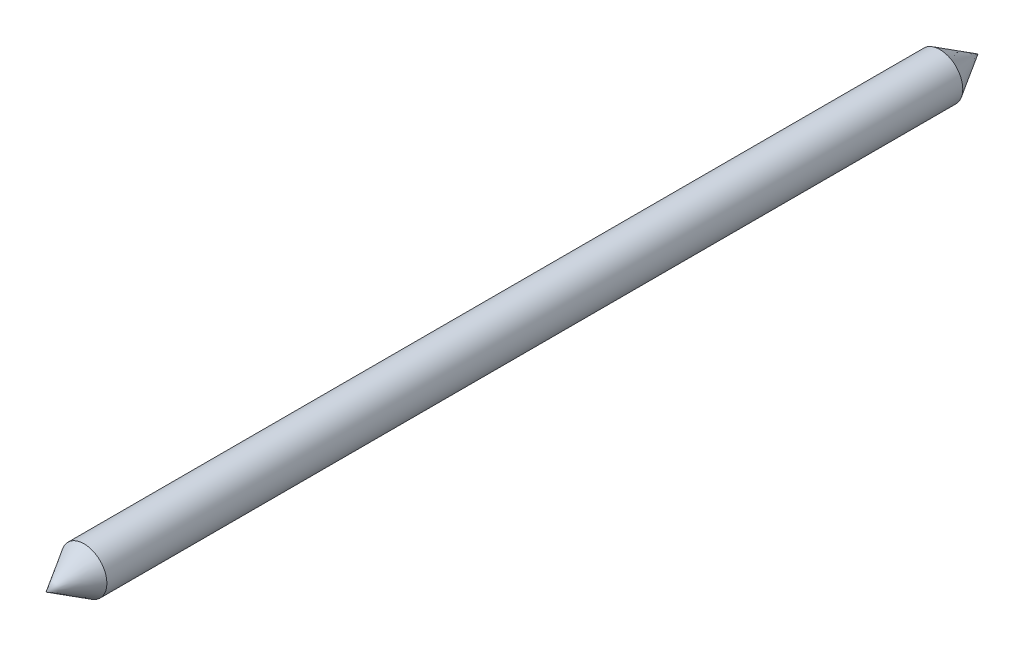
ISO-10303-21;
HEADER;
FILE_DESCRIPTION(('STEP AP214'),'2;1');
FILE_NAME('part.step','',(''),(''),'','','');
FILE_SCHEMA(('AUTOMOTIVE_DESIGN { 1 0 10303 214 1 1 1 1 }'));
ENDSEC;
DATA;
#1=APPLICATION_CONTEXT('core data for automotive mechanical design processes');
#2=APPLICATION_PROTOCOL_DEFINITION('international standard','automotive_design',2000,#1);
#3=PRODUCT_CONTEXT('',#1,'mechanical');
#4=PRODUCT('Part','Part','',(#3));
#5=PRODUCT_RELATED_PRODUCT_CATEGORY('part','',(#4));
#6=PRODUCT_DEFINITION_FORMATION('','',#4);
#7=PRODUCT_DEFINITION_CONTEXT('part definition',#1,'design');
#8=PRODUCT_DEFINITION('design','',#6,#7);
#9=PRODUCT_DEFINITION_SHAPE('','',#8);
#10=(LENGTH_UNIT() NAMED_UNIT(*) SI_UNIT(.MILLI.,.METRE.));
#11=(NAMED_UNIT(*) PLANE_ANGLE_UNIT() SI_UNIT($,.RADIAN.));
#12=(NAMED_UNIT(*) SI_UNIT($,.STERADIAN.) SOLID_ANGLE_UNIT());
#13=UNCERTAINTY_MEASURE_WITH_UNIT(LENGTH_MEASURE(1.E-05),#10,'distance_accuracy_value','');
#14=(GEOMETRIC_REPRESENTATION_CONTEXT(3) GLOBAL_UNCERTAINTY_ASSIGNED_CONTEXT((#13)) GLOBAL_UNIT_ASSIGNED_CONTEXT((#10,
#11,#12)) REPRESENTATION_CONTEXT('',''));
#15=CARTESIAN_POINT('',(0.,0.,0.));
#16=DIRECTION('',(0.,0.,1.));
#17=DIRECTION('',(1.,0.,0.));
#18=AXIS2_PLACEMENT_3D('',#15,#16,#17);
#19=CARTESIAN_POINT('',(0.,0.,-142.875));
#20=DIRECTION('',(0.,0.,1.));
#21=DIRECTION('',(1.,0.,0.));
#22=AXIS2_PLACEMENT_3D('',#19,#20,#21);
#23=CONICAL_SURFACE('',#22,7.62000000000001,0.540419500270585);
#24=CARTESIAN_POINT('',(0.,0.,-155.575));
#25=VERTEX_POINT('',#24);
#26=VERTEX_LOOP('',#25);
#27=FACE_BOUND('',#26,.T.);
#28=CARTESIAN_POINT('',(0.,0.,-142.875));
#29=DIRECTION('',(0.,0.,-1.));
#30=DIRECTION('',(-1.,0.,0.));
#31=AXIS2_PLACEMENT_3D('',#28,#29,#30);
#32=CIRCLE('',#31,7.62000000000001);
#33=CARTESIAN_POINT('',(-7.62,0.,-142.875));
#34=VERTEX_POINT('',#33);
#35=EDGE_CURVE('E11',#34,#34,#32,.T.);
#36=ORIENTED_EDGE('',*,*,#35,.T.);
#37=EDGE_LOOP('',(#36));
#38=FACE_BOUND('',#37,.T.);
#39=ADVANCED_FACE('F45',(#27,#38),#23,.T.);
#40=CARTESIAN_POINT('',(0.,0.,-155.575));
#41=DIRECTION('',(0.,0.,-1.));
#42=DIRECTION('',(-1.,0.,0.));
#43=AXIS2_PLACEMENT_3D('',#40,#41,#42);
#44=CYLINDRICAL_SURFACE('',#43,7.62000000000001);
#45=ORIENTED_EDGE('',*,*,#35,.F.);
#46=EDGE_LOOP('',(#45));
#47=FACE_BOUND('',#46,.T.);
#48=CARTESIAN_POINT('',(0.,0.,142.875));
#49=DIRECTION('',(0.,0.,-1.));
#50=DIRECTION('',(-1.,0.,0.));
#51=AXIS2_PLACEMENT_3D('',#48,#49,#50);
#52=CIRCLE('',#51,7.62000000000001);
#53=CARTESIAN_POINT('',(-7.62,0.,142.875));
#54=VERTEX_POINT('',#53);
#55=EDGE_CURVE('E53',#54,#54,#52,.T.);
#56=ORIENTED_EDGE('',*,*,#55,.T.);
#57=EDGE_LOOP('',(#56));
#58=FACE_BOUND('',#57,.T.);
#59=ADVANCED_FACE('F61',(#47,#58),#44,.T.);
#60=CARTESIAN_POINT('',(0.,0.,155.575));
#61=DIRECTION('',(0.,0.,-1.));
#62=DIRECTION('',(-1.,0.,0.));
#63=AXIS2_PLACEMENT_3D('',#60,#61,#62);
#64=CONICAL_SURFACE('',#63,0.,0.540419500270585);
#65=ORIENTED_EDGE('',*,*,#55,.F.);
#66=EDGE_LOOP('',(#65));
#67=FACE_BOUND('',#66,.T.);
#68=CARTESIAN_POINT('',(0.,0.,155.575));
#69=VERTEX_POINT('',#68);
#70=VERTEX_LOOP('',#69);
#71=FACE_BOUND('',#70,.T.);
#72=ADVANCED_FACE('F59',(#67,#71),#64,.T.);
#73=CLOSED_SHELL('',(#39,#59,#72));
#74=MANIFOLD_SOLID_BREP('B2',#73);
#75=ADVANCED_BREP_SHAPE_REPRESENTATION('',(#18,#74),#14);
#76=SHAPE_DEFINITION_REPRESENTATION(#9,#75);
ENDSEC;
END-ISO-10303-21;
